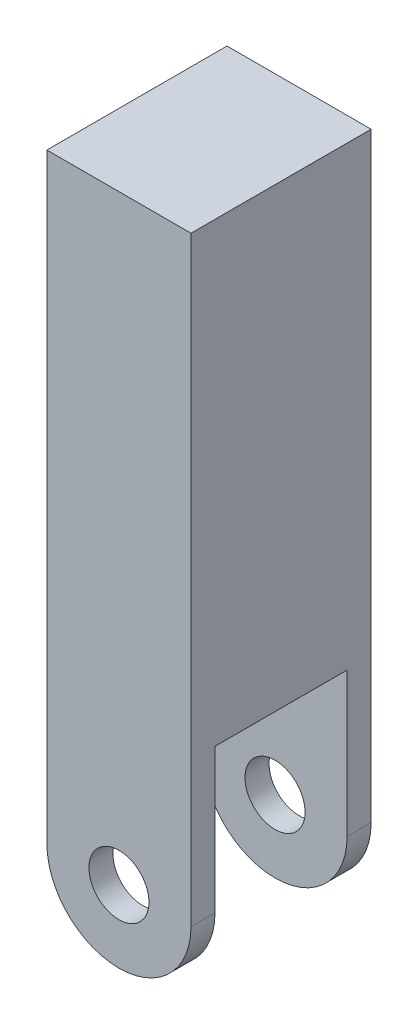
ISO-10303-21;
HEADER;
FILE_DESCRIPTION(('STEP AP214'),'2;1');
FILE_NAME('part.step','',(''),(''),'','','');
FILE_SCHEMA(('AUTOMOTIVE_DESIGN { 1 0 10303 214 1 1 1 1 }'));
ENDSEC;
DATA;
#1=APPLICATION_CONTEXT('core data for automotive mechanical design processes');
#2=APPLICATION_PROTOCOL_DEFINITION('international standard','automotive_design',2000,#1);
#3=PRODUCT_CONTEXT('',#1,'mechanical');
#4=PRODUCT('Part','Part','',(#3));
#5=PRODUCT_RELATED_PRODUCT_CATEGORY('part','',(#4));
#6=PRODUCT_DEFINITION_FORMATION('','',#4);
#7=PRODUCT_DEFINITION_CONTEXT('part definition',#1,'design');
#8=PRODUCT_DEFINITION('design','',#6,#7);
#9=PRODUCT_DEFINITION_SHAPE('','',#8);
#10=(LENGTH_UNIT() NAMED_UNIT(*) SI_UNIT(.MILLI.,.METRE.));
#11=(NAMED_UNIT(*) PLANE_ANGLE_UNIT() SI_UNIT($,.RADIAN.));
#12=(NAMED_UNIT(*) SI_UNIT($,.STERADIAN.) SOLID_ANGLE_UNIT());
#13=UNCERTAINTY_MEASURE_WITH_UNIT(LENGTH_MEASURE(1.E-05),#10,'distance_accuracy_value','');
#14=(GEOMETRIC_REPRESENTATION_CONTEXT(3) GLOBAL_UNCERTAINTY_ASSIGNED_CONTEXT((#13)) GLOBAL_UNIT_ASSIGNED_CONTEXT((#10,
#11,#12)) REPRESENTATION_CONTEXT('',''));
#15=CARTESIAN_POINT('',(0.,0.,0.));
#16=DIRECTION('',(0.,0.,1.));
#17=DIRECTION('',(1.,0.,0.));
#18=AXIS2_PLACEMENT_3D('',#15,#16,#17);
#19=CARTESIAN_POINT('',(0.,0.,7.5));
#20=DIRECTION('',(0.,0.,-1.));
#21=DIRECTION('',(-1.,0.,0.));
#22=AXIS2_PLACEMENT_3D('',#19,#20,#21);
#23=CYLINDRICAL_SURFACE('',#22,6.);
#24=DIRECTION('',(0.,0.,-1.));
#25=VECTOR('',#24,1.);
#26=CARTESIAN_POINT('',(6.,0.,7.5));
#27=LINE('',#26,#25);
#28=CARTESIAN_POINT('',(6.,0.,-5.5));
#29=VERTEX_POINT('',#28);
#30=CARTESIAN_POINT('',(6.,0.,-7.5));
#31=VERTEX_POINT('',#30);
#32=EDGE_CURVE('E42',#29,#31,#27,.T.);
#33=ORIENTED_EDGE('',*,*,#32,.F.);
#34=CARTESIAN_POINT('',(0.,0.,-5.5));
#35=DIRECTION('',(0.,0.,-1.));
#36=DIRECTION('',(0.,1.,0.));
#37=AXIS2_PLACEMENT_3D('',#34,#35,#36);
#38=CIRCLE('',#37,6.);
#39=CARTESIAN_POINT('',(-6.,0.,-5.5));
#40=VERTEX_POINT('',#39);
#41=EDGE_CURVE('E114',#29,#40,#38,.T.);
#42=ORIENTED_EDGE('',*,*,#41,.T.);
#43=DIRECTION('',(0.,0.,-1.));
#44=VECTOR('',#43,1.);
#45=CARTESIAN_POINT('',(-6.,0.,7.5));
#46=LINE('',#45,#44);
#47=CARTESIAN_POINT('',(-6.,0.,-7.5));
#48=VERTEX_POINT('',#47);
#49=EDGE_CURVE('E81',#40,#48,#46,.T.);
#50=ORIENTED_EDGE('',*,*,#49,.T.);
#51=CARTESIAN_POINT('',(0.,0.,-7.5));
#52=DIRECTION('',(0.,0.,1.));
#53=DIRECTION('',(1.,0.,0.));
#54=AXIS2_PLACEMENT_3D('',#51,#52,#53);
#55=CIRCLE('',#54,6.);
#56=EDGE_CURVE('E147',#48,#31,#55,.T.);
#57=ORIENTED_EDGE('',*,*,#56,.T.);
#58=EDGE_LOOP('',(#33,#42,#50,#57));
#59=FACE_BOUND('',#58,.T.);
#60=ADVANCED_FACE('F33',(#59),#23,.T.);
#61=CARTESIAN_POINT('',(0.,0.,7.5));
#62=DIRECTION('',(0.,0.,-1.));
#63=DIRECTION('',(-1.,0.,0.));
#64=AXIS2_PLACEMENT_3D('',#61,#62,#63);
#65=CYLINDRICAL_SURFACE('',#64,2.5);
#66=CARTESIAN_POINT('',(0.,0.,-5.5));
#67=DIRECTION('',(0.,0.,-1.));
#68=DIRECTION('',(0.,1.,0.));
#69=AXIS2_PLACEMENT_3D('',#66,#67,#68);
#70=CIRCLE('',#69,2.5);
#71=CARTESIAN_POINT('',(0.,2.5,-5.5));
#72=VERTEX_POINT('',#71);
#73=EDGE_CURVE('E37',#72,#72,#70,.T.);
#74=ORIENTED_EDGE('',*,*,#73,.F.);
#75=EDGE_LOOP('',(#74));
#76=FACE_BOUND('',#75,.T.);
#77=CARTESIAN_POINT('',(0.,0.,-7.5));
#78=DIRECTION('',(0.,0.,1.));
#79=DIRECTION('',(1.,0.,0.));
#80=AXIS2_PLACEMENT_3D('',#77,#78,#79);
#81=CIRCLE('',#80,2.5);
#82=CARTESIAN_POINT('',(2.5,0.,-7.5));
#83=VERTEX_POINT('',#82);
#84=EDGE_CURVE('E143',#83,#83,#81,.T.);
#85=ORIENTED_EDGE('',*,*,#84,.F.);
#86=EDGE_LOOP('',(#85));
#87=FACE_BOUND('',#86,.T.);
#88=ADVANCED_FACE('F181',(#76,#87),#65,.F.);
#89=CARTESIAN_POINT('',(0.,0.,7.5));
#90=DIRECTION('',(0.,0.,1.));
#91=DIRECTION('',(1.,0.,0.));
#92=AXIS2_PLACEMENT_3D('',#89,#90,#91);
#93=PLANE('',#92);
#94=CARTESIAN_POINT('',(0.,0.,7.5));
#95=DIRECTION('',(0.,0.,1.));
#96=DIRECTION('',(1.,0.,0.));
#97=AXIS2_PLACEMENT_3D('',#94,#95,#96);
#98=CIRCLE('',#97,6.);
#99=CARTESIAN_POINT('',(-6.,0.,7.5));
#100=VERTEX_POINT('',#99);
#101=CARTESIAN_POINT('',(6.,0.,7.5));
#102=VERTEX_POINT('',#101);
#103=EDGE_CURVE('E150',#100,#102,#98,.T.);
#104=ORIENTED_EDGE('',*,*,#103,.T.);
#105=DIRECTION('',(0.,1.,0.));
#106=VECTOR('',#105,1.);
#107=CARTESIAN_POINT('',(6.,50.,7.5));
#108=LINE('',#107,#106);
#109=CARTESIAN_POINT('',(6.,50.,7.5));
#110=VERTEX_POINT('',#109);
#111=EDGE_CURVE('E88',#102,#110,#108,.T.);
#112=ORIENTED_EDGE('',*,*,#111,.T.);
#113=DIRECTION('',(-1.,0.,0.));
#114=VECTOR('',#113,1.);
#115=CARTESIAN_POINT('',(-6.,50.,7.5));
#116=LINE('',#115,#114);
#117=CARTESIAN_POINT('',(-6.,50.,7.5));
#118=VERTEX_POINT('',#117);
#119=EDGE_CURVE('E154',#110,#118,#116,.T.);
#120=ORIENTED_EDGE('',*,*,#119,.T.);
#121=DIRECTION('',(0.,-1.,0.));
#122=VECTOR('',#121,1.);
#123=CARTESIAN_POINT('',(-6.,0.,7.5));
#124=LINE('',#123,#122);
#125=EDGE_CURVE('E59',#118,#100,#124,.T.);
#126=ORIENTED_EDGE('',*,*,#125,.T.);
#127=EDGE_LOOP('',(#104,#112,#120,#126));
#128=FACE_BOUND('',#127,.T.);
#129=CARTESIAN_POINT('',(0.,0.,7.5));
#130=DIRECTION('',(0.,0.,1.));
#131=DIRECTION('',(1.,0.,0.));
#132=AXIS2_PLACEMENT_3D('',#129,#130,#131);
#133=CIRCLE('',#132,2.5);
#134=CARTESIAN_POINT('',(2.5,0.,7.5));
#135=VERTEX_POINT('',#134);
#136=EDGE_CURVE('E144',#135,#135,#133,.T.);
#137=ORIENTED_EDGE('',*,*,#136,.F.);
#138=EDGE_LOOP('',(#137));
#139=FACE_BOUND('',#138,.T.);
#140=ADVANCED_FACE('F184',(#128,#139),#93,.T.);
#141=CARTESIAN_POINT('',(0.,0.,-7.5));
#142=DIRECTION('',(0.,0.,1.));
#143=DIRECTION('',(1.,0.,0.));
#144=AXIS2_PLACEMENT_3D('',#141,#142,#143);
#145=PLANE('',#144);
#146=ORIENTED_EDGE('',*,*,#56,.F.);
#147=DIRECTION('',(0.,-1.,0.));
#148=VECTOR('',#147,1.);
#149=CARTESIAN_POINT('',(-6.,0.,-7.5));
#150=LINE('',#149,#148);
#151=CARTESIAN_POINT('',(-6.,50.,-7.5));
#152=VERTEX_POINT('',#151);
#153=EDGE_CURVE('E152',#152,#48,#150,.T.);
#154=ORIENTED_EDGE('',*,*,#153,.F.);
#155=DIRECTION('',(-1.,0.,0.));
#156=VECTOR('',#155,1.);
#157=CARTESIAN_POINT('',(-6.,50.,-7.5));
#158=LINE('',#157,#156);
#159=CARTESIAN_POINT('',(6.,50.,-7.5));
#160=VERTEX_POINT('',#159);
#161=EDGE_CURVE('E160',#160,#152,#158,.T.);
#162=ORIENTED_EDGE('',*,*,#161,.F.);
#163=DIRECTION('',(0.,1.,0.));
#164=VECTOR('',#163,1.);
#165=CARTESIAN_POINT('',(6.,50.,-7.5));
#166=LINE('',#165,#164);
#167=EDGE_CURVE('E158',#31,#160,#166,.T.);
#168=ORIENTED_EDGE('',*,*,#167,.F.);
#169=EDGE_LOOP('',(#146,#154,#162,#168));
#170=FACE_BOUND('',#169,.T.);
#171=ORIENTED_EDGE('',*,*,#84,.T.);
#172=EDGE_LOOP('',(#171));
#173=FACE_BOUND('',#172,.T.);
#174=ADVANCED_FACE('F186',(#170,#173),#145,.F.);
#175=CARTESIAN_POINT('',(-6.,0.,5.5));
#176=VERTEX_POINT('',#175);
#177=EDGE_CURVE('E163',#100,#176,#46,.T.);
#178=ORIENTED_EDGE('',*,*,#177,.T.);
#179=CARTESIAN_POINT('',(0.,0.,5.5));
#180=DIRECTION('',(0.,0.,1.));
#181=DIRECTION('',(0.,-1.,0.));
#182=AXIS2_PLACEMENT_3D('',#179,#180,#181);
#183=CIRCLE('',#182,6.);
#184=CARTESIAN_POINT('',(6.,0.,5.5));
#185=VERTEX_POINT('',#184);
#186=EDGE_CURVE('E139',#176,#185,#183,.T.);
#187=ORIENTED_EDGE('',*,*,#186,.T.);
#188=EDGE_CURVE('E11',#102,#185,#27,.T.);
#189=ORIENTED_EDGE('',*,*,#188,.F.);
#190=ORIENTED_EDGE('',*,*,#103,.F.);
#191=EDGE_LOOP('',(#178,#187,#189,#190));
#192=FACE_BOUND('',#191,.T.);
#193=ADVANCED_FACE('F35',(#192),#23,.T.);
#194=CARTESIAN_POINT('',(6.,50.,7.5));
#195=DIRECTION('',(-1.,0.,0.));
#196=DIRECTION('',(0.,0.,1.));
#197=AXIS2_PLACEMENT_3D('',#194,#195,#196);
#198=PLANE('',#197);
#199=DIRECTION('',(0.,0.,1.));
#200=VECTOR('',#199,1.);
#201=CARTESIAN_POINT('',(6.,12.,5.50000000000001));
#202=LINE('',#201,#200);
#203=CARTESIAN_POINT('',(6.,12.,-5.49999999999999));
#204=VERTEX_POINT('',#203);
#205=CARTESIAN_POINT('',(6.,12.,5.50000000000001));
#206=VERTEX_POINT('',#205);
#207=EDGE_CURVE('E117',#204,#206,#202,.T.);
#208=ORIENTED_EDGE('',*,*,#207,.F.);
#209=DIRECTION('',(0.,1.,0.));
#210=VECTOR('',#209,1.);
#211=CARTESIAN_POINT('',(6.,12.,-5.49999999999999));
#212=LINE('',#211,#210);
#213=EDGE_CURVE('E109',#29,#204,#212,.T.);
#214=ORIENTED_EDGE('',*,*,#213,.F.);
#215=ORIENTED_EDGE('',*,*,#32,.T.);
#216=ORIENTED_EDGE('',*,*,#167,.T.);
#217=DIRECTION('',(0.,0.,-1.));
#218=VECTOR('',#217,1.);
#219=CARTESIAN_POINT('',(6.,50.,7.5));
#220=LINE('',#219,#218);
#221=EDGE_CURVE('E169',#110,#160,#220,.T.);
#222=ORIENTED_EDGE('',*,*,#221,.F.);
#223=ORIENTED_EDGE('',*,*,#111,.F.);
#224=ORIENTED_EDGE('',*,*,#188,.T.);
#225=DIRECTION('',(0.,-1.,0.));
#226=VECTOR('',#225,1.);
#227=CARTESIAN_POINT('',(6.,12.,5.50000000000001));
#228=LINE('',#227,#226);
#229=EDGE_CURVE('E129',#206,#185,#228,.T.);
#230=ORIENTED_EDGE('',*,*,#229,.F.);
#231=EDGE_LOOP('',(#208,#214,#215,#216,#222,#223,#224,#230));
#232=FACE_BOUND('',#231,.T.);
#233=ADVANCED_FACE('F128',(#232),#198,.F.);
#234=CARTESIAN_POINT('',(-6.,50.,7.5));
#235=DIRECTION('',(0.,-1.,0.));
#236=DIRECTION('',(0.,0.,-1.));
#237=AXIS2_PLACEMENT_3D('',#234,#235,#236);
#238=PLANE('',#237);
#239=ORIENTED_EDGE('',*,*,#161,.T.);
#240=DIRECTION('',(0.,0.,-1.));
#241=VECTOR('',#240,1.);
#242=CARTESIAN_POINT('',(-6.,50.,7.5));
#243=LINE('',#242,#241);
#244=EDGE_CURVE('E166',#118,#152,#243,.T.);
#245=ORIENTED_EDGE('',*,*,#244,.F.);
#246=ORIENTED_EDGE('',*,*,#119,.F.);
#247=ORIENTED_EDGE('',*,*,#221,.T.);
#248=EDGE_LOOP('',(#239,#245,#246,#247));
#249=FACE_BOUND('',#248,.T.);
#250=ADVANCED_FACE('F203',(#249),#238,.F.);
#251=CARTESIAN_POINT('',(-6.,0.,7.5));
#252=DIRECTION('',(1.,0.,0.));
#253=DIRECTION('',(0.,0.,-1.));
#254=AXIS2_PLACEMENT_3D('',#251,#252,#253);
#255=PLANE('',#254);
#256=ORIENTED_EDGE('',*,*,#49,.F.);
#257=DIRECTION('',(0.,1.,0.));
#258=VECTOR('',#257,1.);
#259=CARTESIAN_POINT('',(-6.,12.,-5.49999999999999));
#260=LINE('',#259,#258);
#261=CARTESIAN_POINT('',(-6.,12.,-5.49999999999999));
#262=VERTEX_POINT('',#261);
#263=EDGE_CURVE('E131',#40,#262,#260,.T.);
#264=ORIENTED_EDGE('',*,*,#263,.T.);
#265=DIRECTION('',(0.,0.,1.));
#266=VECTOR('',#265,1.);
#267=CARTESIAN_POINT('',(-6.,12.,5.50000000000001));
#268=LINE('',#267,#266);
#269=CARTESIAN_POINT('',(-6.,12.,5.50000000000001));
#270=VERTEX_POINT('',#269);
#271=EDGE_CURVE('E124',#262,#270,#268,.T.);
#272=ORIENTED_EDGE('',*,*,#271,.T.);
#273=DIRECTION('',(0.,-1.,0.));
#274=VECTOR('',#273,1.);
#275=CARTESIAN_POINT('',(-6.,12.,5.50000000000001));
#276=LINE('',#275,#274);
#277=EDGE_CURVE('E50',#270,#176,#276,.T.);
#278=ORIENTED_EDGE('',*,*,#277,.T.);
#279=ORIENTED_EDGE('',*,*,#177,.F.);
#280=ORIENTED_EDGE('',*,*,#125,.F.);
#281=ORIENTED_EDGE('',*,*,#244,.T.);
#282=ORIENTED_EDGE('',*,*,#153,.T.);
#283=EDGE_LOOP('',(#256,#264,#272,#278,#279,#280,#281,#282));
#284=FACE_BOUND('',#283,.T.);
#285=ADVANCED_FACE('F179',(#284),#255,.F.);
#286=CARTESIAN_POINT('',(0.,0.,5.5));
#287=DIRECTION('',(0.,0.,1.));
#288=DIRECTION('',(0.,-1.,0.));
#289=AXIS2_PLACEMENT_3D('',#286,#287,#288);
#290=CIRCLE('',#289,2.5);
#291=CARTESIAN_POINT('',(0.,-2.5,5.5));
#292=VERTEX_POINT('',#291);
#293=EDGE_CURVE('E137',#292,#292,#290,.T.);
#294=ORIENTED_EDGE('',*,*,#293,.F.);
#295=EDGE_LOOP('',(#294));
#296=FACE_BOUND('',#295,.T.);
#297=ORIENTED_EDGE('',*,*,#136,.T.);
#298=EDGE_LOOP('',(#297));
#299=FACE_BOUND('',#298,.T.);
#300=ADVANCED_FACE('F176',(#296,#299),#65,.F.);
#301=CARTESIAN_POINT('',(-6.,12.,-5.49999999999999));
#302=DIRECTION('',(0.,0.,-1.));
#303=DIRECTION('',(0.,1.,0.));
#304=AXIS2_PLACEMENT_3D('',#301,#302,#303);
#305=PLANE('',#304);
#306=ORIENTED_EDGE('',*,*,#73,.T.);
#307=EDGE_LOOP('',(#306));
#308=FACE_BOUND('',#307,.T.);
#309=ORIENTED_EDGE('',*,*,#213,.T.);
#310=DIRECTION('',(1.,0.,0.));
#311=VECTOR('',#310,1.);
#312=CARTESIAN_POINT('',(-6.,12.,-5.49999999999999));
#313=LINE('',#312,#311);
#314=EDGE_CURVE('E112',#262,#204,#313,.T.);
#315=ORIENTED_EDGE('',*,*,#314,.F.);
#316=ORIENTED_EDGE('',*,*,#263,.F.);
#317=ORIENTED_EDGE('',*,*,#41,.F.);
#318=EDGE_LOOP('',(#309,#315,#316,#317));
#319=FACE_BOUND('',#318,.T.);
#320=ADVANCED_FACE('F111',(#308,#319),#305,.F.);
#321=CARTESIAN_POINT('',(-6.,12.,5.50000000000001));
#322=DIRECTION('',(0.,0.,1.));
#323=DIRECTION('',(0.,-1.,0.));
#324=AXIS2_PLACEMENT_3D('',#321,#322,#323);
#325=PLANE('',#324);
#326=ORIENTED_EDGE('',*,*,#293,.T.);
#327=EDGE_LOOP('',(#326));
#328=FACE_BOUND('',#327,.T.);
#329=ORIENTED_EDGE('',*,*,#277,.F.);
#330=DIRECTION('',(1.,0.,0.));
#331=VECTOR('',#330,1.);
#332=CARTESIAN_POINT('',(-6.,12.,5.50000000000001));
#333=LINE('',#332,#331);
#334=EDGE_CURVE('E126',#270,#206,#333,.T.);
#335=ORIENTED_EDGE('',*,*,#334,.T.);
#336=ORIENTED_EDGE('',*,*,#229,.T.);
#337=ORIENTED_EDGE('',*,*,#186,.F.);
#338=EDGE_LOOP('',(#329,#335,#336,#337));
#339=FACE_BOUND('',#338,.T.);
#340=ADVANCED_FACE('F174',(#328,#339),#325,.F.);
#341=CARTESIAN_POINT('',(-6.,12.,5.50000000000001));
#342=DIRECTION('',(0.,1.,0.));
#343=DIRECTION('',(0.,0.,1.));
#344=AXIS2_PLACEMENT_3D('',#341,#342,#343);
#345=PLANE('',#344);
#346=ORIENTED_EDGE('',*,*,#334,.F.);
#347=ORIENTED_EDGE('',*,*,#271,.F.);
#348=ORIENTED_EDGE('',*,*,#314,.T.);
#349=ORIENTED_EDGE('',*,*,#207,.T.);
#350=EDGE_LOOP('',(#346,#347,#348,#349));
#351=FACE_BOUND('',#350,.T.);
#352=ADVANCED_FACE('F121',(#351),#345,.F.);
#353=CLOSED_SHELL('',(#60,#88,#140,#174,#193,#233,#250,#285,#300,#320,#340,#352));
#354=MANIFOLD_SOLID_BREP('B2',#353);
#355=ADVANCED_BREP_SHAPE_REPRESENTATION('',(#18,#354),#14);
#356=SHAPE_DEFINITION_REPRESENTATION(#9,#355);
ENDSEC;
END-ISO-10303-21;
